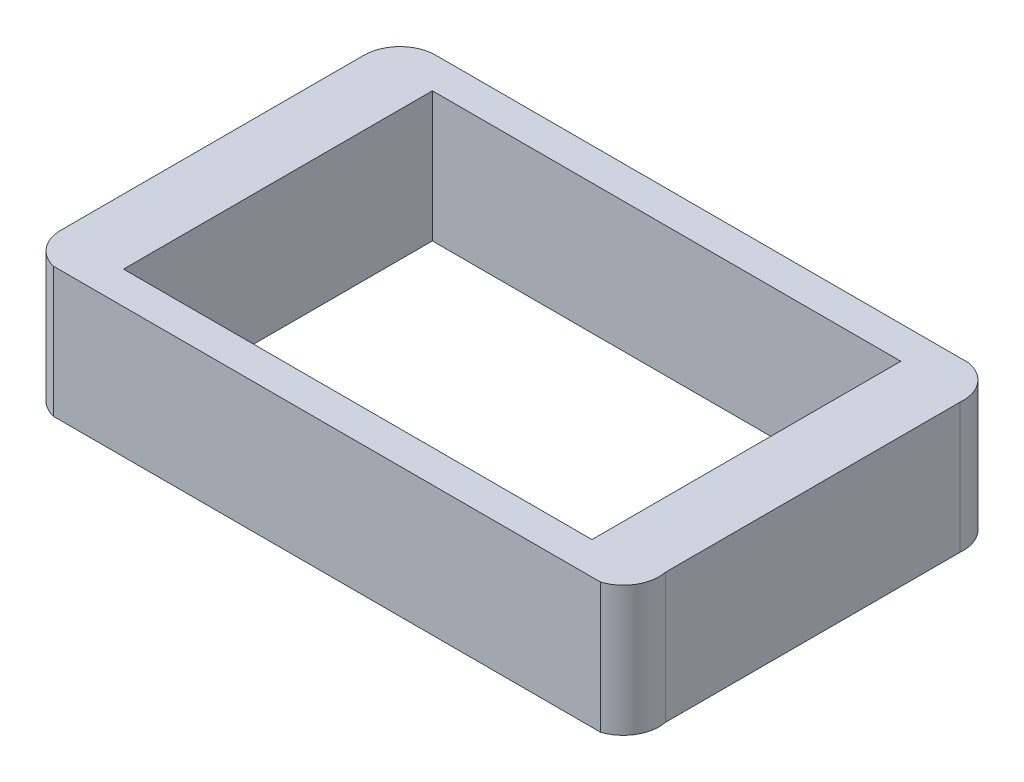
ISO-10303-21;
HEADER;
FILE_DESCRIPTION(('STEP AP214'),'2;1');
FILE_NAME('part.step','',(''),(''),'','','');
FILE_SCHEMA(('AUTOMOTIVE_DESIGN { 1 0 10303 214 1 1 1 1 }'));
ENDSEC;
DATA;
#1=APPLICATION_CONTEXT('core data for automotive mechanical design processes');
#2=APPLICATION_PROTOCOL_DEFINITION('international standard','automotive_design',2000,#1);
#3=PRODUCT_CONTEXT('',#1,'mechanical');
#4=PRODUCT('Part','Part','',(#3));
#5=PRODUCT_RELATED_PRODUCT_CATEGORY('part','',(#4));
#6=PRODUCT_DEFINITION_FORMATION('','',#4);
#7=PRODUCT_DEFINITION_CONTEXT('part definition',#1,'design');
#8=PRODUCT_DEFINITION('design','',#6,#7);
#9=PRODUCT_DEFINITION_SHAPE('','',#8);
#10=(LENGTH_UNIT() NAMED_UNIT(*) SI_UNIT(.MILLI.,.METRE.));
#11=(NAMED_UNIT(*) PLANE_ANGLE_UNIT() SI_UNIT($,.RADIAN.));
#12=(NAMED_UNIT(*) SI_UNIT($,.STERADIAN.) SOLID_ANGLE_UNIT());
#13=UNCERTAINTY_MEASURE_WITH_UNIT(LENGTH_MEASURE(1.E-05),#10,'distance_accuracy_value','');
#14=(GEOMETRIC_REPRESENTATION_CONTEXT(3) GLOBAL_UNCERTAINTY_ASSIGNED_CONTEXT((#13)) GLOBAL_UNIT_ASSIGNED_CONTEXT((#10,
#11,#12)) REPRESENTATION_CONTEXT('',''));
#15=CARTESIAN_POINT('',(0.,0.,0.));
#16=DIRECTION('',(0.,0.,1.));
#17=DIRECTION('',(1.,0.,0.));
#18=AXIS2_PLACEMENT_3D('',#15,#16,#17);
#19=CARTESIAN_POINT('',(-83.0138961913686,40.,-48.3517475262665));
#20=DIRECTION('',(0.,-1.,0.));
#21=DIRECTION('',(0.,0.,-1.));
#22=AXIS2_PLACEMENT_3D('',#19,#20,#21);
#23=PLANE('',#22);
#24=CARTESIAN_POINT('',(-83.0138961913686,40.,-48.3517475262665));
#25=DIRECTION('',(0.,1.,0.));
#26=DIRECTION('',(0.,0.,-1.));
#27=AXIS2_PLACEMENT_3D('',#24,#25,#26);
#28=CIRCLE('',#27,11.);
#29=CARTESIAN_POINT('',(-82.9854633410944,40.,-59.3517107795244));
#30=VERTEX_POINT('',#29);
#31=CARTESIAN_POINT('',(-94.0138594446266,40.,-48.3801803765406));
#32=VERTEX_POINT('',#31);
#33=EDGE_CURVE('E158',#30,#32,#28,.T.);
#34=ORIENTED_EDGE('',*,*,#33,.T.);
#35=DIRECTION('',(0.,0.,1.));
#36=VECTOR('',#35,1.);
#37=CARTESIAN_POINT('',(-94.0138594446266,40.,45.2987333063489));
#38=LINE('',#37,#36);
#39=CARTESIAN_POINT('',(-94.0138594446266,40.,45.2987333063489));
#40=VERTEX_POINT('',#39);
#41=EDGE_CURVE('E161',#32,#40,#38,.T.);
#42=ORIENTED_EDGE('',*,*,#41,.T.);
#43=CARTESIAN_POINT('',(-83.0195494276521,40.,44.9449717331755));
#44=DIRECTION('',(0.,1.,0.));
#45=DIRECTION('',(0.,0.,1.));
#46=AXIS2_PLACEMENT_3D('',#43,#44,#45);
#47=CIRCLE('',#46,11.);
#48=CARTESIAN_POINT('',(-85.5570668691795,40.,55.6482892204756));
#49=VERTEX_POINT('',#48);
#50=EDGE_CURVE('E164',#40,#49,#47,.T.);
#51=ORIENTED_EDGE('',*,*,#50,.T.);
#52=DIRECTION('',(1.,0.,0.));
#53=VECTOR('',#52,1.);
#54=CARTESIAN_POINT('',(82.7090211570023,40.,55.6482892204756));
#55=LINE('',#54,#53);
#56=CARTESIAN_POINT('',(82.7090211570023,40.,55.6482892204756));
#57=VERTEX_POINT('',#56);
#58=EDGE_CURVE('E166',#49,#57,#55,.T.);
#59=ORIENTED_EDGE('',*,*,#58,.T.);
#60=CARTESIAN_POINT('',(79.2707890930218,40.,45.1994347246844));
#61=DIRECTION('',(0.,1.,0.));
#62=DIRECTION('',(0.,0.,1.));
#63=AXIS2_PLACEMENT_3D('',#60,#61,#62);
#64=CIRCLE('',#63,11.);
#65=CARTESIAN_POINT('',(90.0633574660827,40.,43.0732955211498));
#66=VERTEX_POINT('',#65);
#67=EDGE_CURVE('E168',#57,#66,#64,.T.);
#68=ORIENTED_EDGE('',*,*,#67,.T.);
#69=DIRECTION('',(0.,0.,-1.));
#70=VECTOR('',#69,1.);
#71=CARTESIAN_POINT('',(90.0633574660827,40.,43.0732955211498));
#72=LINE('',#71,#70);
#73=CARTESIAN_POINT('',(90.0633574660827,40.,-47.5439350308669));
#74=VERTEX_POINT('',#73);
#75=EDGE_CURVE('E170',#66,#74,#72,.T.);
#76=ORIENTED_EDGE('',*,*,#75,.T.);
#77=CARTESIAN_POINT('',(79.1044180856765,40.,-48.4934863231006));
#78=DIRECTION('',(0.,1.,0.));
#79=DIRECTION('',(0.,0.,-1.));
#80=AXIS2_PLACEMENT_3D('',#77,#78,#79);
#81=CIRCLE('',#80,11.);
#82=CARTESIAN_POINT('',(80.8648048766744,40.,-59.3517107795244));
#83=VERTEX_POINT('',#82);
#84=EDGE_CURVE('E172',#74,#83,#81,.T.);
#85=ORIENTED_EDGE('',*,*,#84,.T.);
#86=DIRECTION('',(-1.,0.,0.));
#87=VECTOR('',#86,1.);
#88=CARTESIAN_POINT('',(80.8648048766744,40.,-59.3517107795244));
#89=LINE('',#88,#87);
#90=EDGE_CURVE('E174',#83,#30,#89,.T.);
#91=ORIENTED_EDGE('',*,*,#90,.T.);
#92=EDGE_LOOP('',(#34,#42,#51,#59,#68,#76,#85,#91));
#93=FACE_BOUND('',#92,.T.);
#94=DIRECTION('',(0.,0.,1.));
#95=VECTOR('',#94,1.);
#96=CARTESIAN_POINT('',(-74.0138594446266,40.,45.6482892204756));
#97=LINE('',#96,#95);
#98=CARTESIAN_POINT('',(-74.0138594446266,40.,-49.3517107795244));
#99=VERTEX_POINT('',#98);
#100=CARTESIAN_POINT('',(-74.0138594446266,40.,45.6482892204756));
#101=VERTEX_POINT('',#100);
#102=EDGE_CURVE('E122',#99,#101,#97,.T.);
#103=ORIENTED_EDGE('',*,*,#102,.F.);
#104=DIRECTION('',(-1.,0.,0.));
#105=VECTOR('',#104,1.);
#106=CARTESIAN_POINT('',(70.0633574660827,40.,-49.3517107795244));
#107=LINE('',#106,#105);
#108=CARTESIAN_POINT('',(70.0633574660827,40.,-49.3517107795244));
#109=VERTEX_POINT('',#108);
#110=EDGE_CURVE('E144',#109,#99,#107,.T.);
#111=ORIENTED_EDGE('',*,*,#110,.F.);
#112=DIRECTION('',(0.,0.,-1.));
#113=VECTOR('',#112,1.);
#114=CARTESIAN_POINT('',(70.0633574660827,40.,45.6482892204756));
#115=LINE('',#114,#113);
#116=CARTESIAN_POINT('',(70.0633574660827,40.,45.6482892204756));
#117=VERTEX_POINT('',#116);
#118=EDGE_CURVE('E142',#117,#109,#115,.T.);
#119=ORIENTED_EDGE('',*,*,#118,.F.);
#120=DIRECTION('',(1.,0.,0.));
#121=VECTOR('',#120,1.);
#122=CARTESIAN_POINT('',(70.0633574660827,40.,45.6482892204756));
#123=LINE('',#122,#121);
#124=EDGE_CURVE('E130',#101,#117,#123,.T.);
#125=ORIENTED_EDGE('',*,*,#124,.F.);
#126=EDGE_LOOP('',(#103,#111,#119,#125));
#127=FACE_BOUND('',#126,.T.);
#128=ADVANCED_FACE('F33',(#93,#127),#23,.F.);
#129=CARTESIAN_POINT('',(-83.0138961913686,0.,-48.3517475262665));
#130=DIRECTION('',(0.,-1.,0.));
#131=DIRECTION('',(0.,0.,-1.));
#132=AXIS2_PLACEMENT_3D('',#129,#130,#131);
#133=PLANE('',#132);
#134=CARTESIAN_POINT('',(-83.0138961913686,0.,-48.3517475262665));
#135=DIRECTION('',(0.,1.,0.));
#136=DIRECTION('',(0.,0.,-1.));
#137=AXIS2_PLACEMENT_3D('',#134,#135,#136);
#138=CIRCLE('',#137,11.);
#139=CARTESIAN_POINT('',(-82.9854633410944,0.,-59.3517107795244));
#140=VERTEX_POINT('',#139);
#141=CARTESIAN_POINT('',(-94.0138594446266,0.,-48.3801803765406));
#142=VERTEX_POINT('',#141);
#143=EDGE_CURVE('E138',#140,#142,#138,.T.);
#144=ORIENTED_EDGE('',*,*,#143,.F.);
#145=DIRECTION('',(-1.,0.,0.));
#146=VECTOR('',#145,1.);
#147=CARTESIAN_POINT('',(80.8648048766744,0.,-59.3517107795244));
#148=LINE('',#147,#146);
#149=CARTESIAN_POINT('',(80.8648048766744,0.,-59.3517107795244));
#150=VERTEX_POINT('',#149);
#151=EDGE_CURVE('E162',#150,#140,#148,.T.);
#152=ORIENTED_EDGE('',*,*,#151,.F.);
#153=CARTESIAN_POINT('',(79.1044180856765,0.,-48.4934863231006));
#154=DIRECTION('',(0.,1.,0.));
#155=DIRECTION('',(0.,0.,-1.));
#156=AXIS2_PLACEMENT_3D('',#153,#154,#155);
#157=CIRCLE('',#156,11.);
#158=CARTESIAN_POINT('',(90.0633574660827,0.,-47.5439350308669));
#159=VERTEX_POINT('',#158);
#160=EDGE_CURVE('E189',#159,#150,#157,.T.);
#161=ORIENTED_EDGE('',*,*,#160,.F.);
#162=DIRECTION('',(0.,0.,-1.));
#163=VECTOR('',#162,1.);
#164=CARTESIAN_POINT('',(90.0633574660827,0.,43.0732955211498));
#165=LINE('',#164,#163);
#166=CARTESIAN_POINT('',(90.0633574660827,0.,43.0732955211498));
#167=VERTEX_POINT('',#166);
#168=EDGE_CURVE('E187',#167,#159,#165,.T.);
#169=ORIENTED_EDGE('',*,*,#168,.F.);
#170=CARTESIAN_POINT('',(79.2707890930218,0.,45.1994347246844));
#171=DIRECTION('',(0.,1.,0.));
#172=DIRECTION('',(0.,0.,1.));
#173=AXIS2_PLACEMENT_3D('',#170,#171,#172);
#174=CIRCLE('',#173,11.);
#175=CARTESIAN_POINT('',(82.7090211570023,0.,55.6482892204756));
#176=VERTEX_POINT('',#175);
#177=EDGE_CURVE('E185',#176,#167,#174,.T.);
#178=ORIENTED_EDGE('',*,*,#177,.F.);
#179=DIRECTION('',(1.,0.,0.));
#180=VECTOR('',#179,1.);
#181=CARTESIAN_POINT('',(82.7090211570023,0.,55.6482892204756));
#182=LINE('',#181,#180);
#183=CARTESIAN_POINT('',(-85.5570668691795,0.,55.6482892204756));
#184=VERTEX_POINT('',#183);
#185=EDGE_CURVE('E183',#184,#176,#182,.T.);
#186=ORIENTED_EDGE('',*,*,#185,.F.);
#187=CARTESIAN_POINT('',(-83.0195494276521,0.,44.9449717331755));
#188=DIRECTION('',(0.,1.,0.));
#189=DIRECTION('',(0.,0.,1.));
#190=AXIS2_PLACEMENT_3D('',#187,#188,#189);
#191=CIRCLE('',#190,11.);
#192=CARTESIAN_POINT('',(-94.0138594446266,0.,45.2987333063489));
#193=VERTEX_POINT('',#192);
#194=EDGE_CURVE('E181',#193,#184,#191,.T.);
#195=ORIENTED_EDGE('',*,*,#194,.F.);
#196=DIRECTION('',(0.,0.,1.));
#197=VECTOR('',#196,1.);
#198=CARTESIAN_POINT('',(-94.0138594446266,0.,45.2987333063489));
#199=LINE('',#198,#197);
#200=EDGE_CURVE('E179',#142,#193,#199,.T.);
#201=ORIENTED_EDGE('',*,*,#200,.F.);
#202=EDGE_LOOP('',(#144,#152,#161,#169,#178,#186,#195,#201));
#203=FACE_BOUND('',#202,.T.);
#204=DIRECTION('',(-1.,0.,0.));
#205=VECTOR('',#204,1.);
#206=CARTESIAN_POINT('',(70.0633574660827,0.,-49.3517107795244));
#207=LINE('',#206,#205);
#208=CARTESIAN_POINT('',(70.0633574660827,0.,-49.3517107795244));
#209=VERTEX_POINT('',#208);
#210=CARTESIAN_POINT('',(-74.0138594446266,0.,-49.3517107795244));
#211=VERTEX_POINT('',#210);
#212=EDGE_CURVE('E131',#209,#211,#207,.T.);
#213=ORIENTED_EDGE('',*,*,#212,.T.);
#214=DIRECTION('',(0.,0.,1.));
#215=VECTOR('',#214,1.);
#216=CARTESIAN_POINT('',(-74.0138594446266,0.,45.6482892204756));
#217=LINE('',#216,#215);
#218=CARTESIAN_POINT('',(-74.0138594446266,0.,45.6482892204756));
#219=VERTEX_POINT('',#218);
#220=EDGE_CURVE('E56',#211,#219,#217,.T.);
#221=ORIENTED_EDGE('',*,*,#220,.T.);
#222=DIRECTION('',(1.,0.,0.));
#223=VECTOR('',#222,1.);
#224=CARTESIAN_POINT('',(70.0633574660827,0.,45.6482892204756));
#225=LINE('',#224,#223);
#226=CARTESIAN_POINT('',(70.0633574660827,0.,45.6482892204756));
#227=VERTEX_POINT('',#226);
#228=EDGE_CURVE('E137',#219,#227,#225,.T.);
#229=ORIENTED_EDGE('',*,*,#228,.T.);
#230=DIRECTION('',(0.,0.,-1.));
#231=VECTOR('',#230,1.);
#232=CARTESIAN_POINT('',(70.0633574660827,0.,45.6482892204756));
#233=LINE('',#232,#231);
#234=EDGE_CURVE('E150',#227,#209,#233,.T.);
#235=ORIENTED_EDGE('',*,*,#234,.T.);
#236=EDGE_LOOP('',(#213,#221,#229,#235));
#237=FACE_BOUND('',#236,.T.);
#238=ADVANCED_FACE('F219',(#203,#237),#133,.T.);
#239=CARTESIAN_POINT('',(-83.0138961913686,40.,-48.3517475262665));
#240=DIRECTION('',(0.,-1.,0.));
#241=DIRECTION('',(0.,0.,-1.));
#242=AXIS2_PLACEMENT_3D('',#239,#240,#241);
#243=CYLINDRICAL_SURFACE('',#242,11.);
#244=ORIENTED_EDGE('',*,*,#143,.T.);
#245=DIRECTION('',(0.,-1.,0.));
#246=VECTOR('',#245,1.);
#247=CARTESIAN_POINT('',(-94.0138594446266,40.,-48.3801803765406));
#248=LINE('',#247,#246);
#249=EDGE_CURVE('E11',#32,#142,#248,.T.);
#250=ORIENTED_EDGE('',*,*,#249,.F.);
#251=ORIENTED_EDGE('',*,*,#33,.F.);
#252=DIRECTION('',(0.,-1.,0.));
#253=VECTOR('',#252,1.);
#254=CARTESIAN_POINT('',(-82.9854633410944,40.,-59.3517107795244));
#255=LINE('',#254,#253);
#256=EDGE_CURVE('E176',#30,#140,#255,.T.);
#257=ORIENTED_EDGE('',*,*,#256,.T.);
#258=EDGE_LOOP('',(#244,#250,#251,#257));
#259=FACE_BOUND('',#258,.T.);
#260=ADVANCED_FACE('F35',(#259),#243,.T.);
#261=CARTESIAN_POINT('',(-94.0138594446266,40.,45.2987333063489));
#262=DIRECTION('',(1.,0.,0.));
#263=DIRECTION('',(0.,0.,-1.));
#264=AXIS2_PLACEMENT_3D('',#261,#262,#263);
#265=PLANE('',#264);
#266=ORIENTED_EDGE('',*,*,#200,.T.);
#267=DIRECTION('',(0.,-1.,0.));
#268=VECTOR('',#267,1.);
#269=CARTESIAN_POINT('',(-94.0138594446266,40.,45.2987333063489));
#270=LINE('',#269,#268);
#271=EDGE_CURVE('E41',#40,#193,#270,.T.);
#272=ORIENTED_EDGE('',*,*,#271,.F.);
#273=ORIENTED_EDGE('',*,*,#41,.F.);
#274=ORIENTED_EDGE('',*,*,#249,.T.);
#275=EDGE_LOOP('',(#266,#272,#273,#274));
#276=FACE_BOUND('',#275,.T.);
#277=ADVANCED_FACE('F236',(#276),#265,.F.);
#278=CARTESIAN_POINT('',(-83.0195494276521,40.,44.9449717331755));
#279=DIRECTION('',(0.,-1.,0.));
#280=DIRECTION('',(0.,0.,-1.));
#281=AXIS2_PLACEMENT_3D('',#278,#279,#280);
#282=CYLINDRICAL_SURFACE('',#281,11.);
#283=ORIENTED_EDGE('',*,*,#194,.T.);
#284=DIRECTION('',(0.,-1.,0.));
#285=VECTOR('',#284,1.);
#286=CARTESIAN_POINT('',(-85.5570668691795,40.,55.6482892204756));
#287=LINE('',#286,#285);
#288=EDGE_CURVE('E206',#49,#184,#287,.T.);
#289=ORIENTED_EDGE('',*,*,#288,.F.);
#290=ORIENTED_EDGE('',*,*,#50,.F.);
#291=ORIENTED_EDGE('',*,*,#271,.T.);
#292=EDGE_LOOP('',(#283,#289,#290,#291));
#293=FACE_BOUND('',#292,.T.);
#294=ADVANCED_FACE('F213',(#293),#282,.T.);
#295=CARTESIAN_POINT('',(82.7090211570023,40.,55.6482892204756));
#296=DIRECTION('',(0.,0.,-1.));
#297=DIRECTION('',(-1.,0.,0.));
#298=AXIS2_PLACEMENT_3D('',#295,#296,#297);
#299=PLANE('',#298);
#300=ORIENTED_EDGE('',*,*,#185,.T.);
#301=DIRECTION('',(0.,-1.,0.));
#302=VECTOR('',#301,1.);
#303=CARTESIAN_POINT('',(82.7090211570023,40.,55.6482892204756));
#304=LINE('',#303,#302);
#305=EDGE_CURVE('E203',#57,#176,#304,.T.);
#306=ORIENTED_EDGE('',*,*,#305,.F.);
#307=ORIENTED_EDGE('',*,*,#58,.F.);
#308=ORIENTED_EDGE('',*,*,#288,.T.);
#309=EDGE_LOOP('',(#300,#306,#307,#308));
#310=FACE_BOUND('',#309,.T.);
#311=ADVANCED_FACE('F225',(#310),#299,.F.);
#312=CARTESIAN_POINT('',(79.2707890930218,40.,45.1994347246844));
#313=DIRECTION('',(0.,-1.,0.));
#314=DIRECTION('',(0.,0.,-1.));
#315=AXIS2_PLACEMENT_3D('',#312,#313,#314);
#316=CYLINDRICAL_SURFACE('',#315,11.);
#317=ORIENTED_EDGE('',*,*,#177,.T.);
#318=DIRECTION('',(0.,-1.,0.));
#319=VECTOR('',#318,1.);
#320=CARTESIAN_POINT('',(90.0633574660827,40.,43.0732955211498));
#321=LINE('',#320,#319);
#322=EDGE_CURVE('E200',#66,#167,#321,.T.);
#323=ORIENTED_EDGE('',*,*,#322,.F.);
#324=ORIENTED_EDGE('',*,*,#67,.F.);
#325=ORIENTED_EDGE('',*,*,#305,.T.);
#326=EDGE_LOOP('',(#317,#323,#324,#325));
#327=FACE_BOUND('',#326,.T.);
#328=ADVANCED_FACE('F229',(#327),#316,.T.);
#329=CARTESIAN_POINT('',(90.0633574660827,40.,43.0732955211498));
#330=DIRECTION('',(-1.,0.,0.));
#331=DIRECTION('',(0.,0.,1.));
#332=AXIS2_PLACEMENT_3D('',#329,#330,#331);
#333=PLANE('',#332);
#334=ORIENTED_EDGE('',*,*,#168,.T.);
#335=DIRECTION('',(0.,-1.,0.));
#336=VECTOR('',#335,1.);
#337=CARTESIAN_POINT('',(90.0633574660827,40.,-47.5439350308669));
#338=LINE('',#337,#336);
#339=EDGE_CURVE('E197',#74,#159,#338,.T.);
#340=ORIENTED_EDGE('',*,*,#339,.F.);
#341=ORIENTED_EDGE('',*,*,#75,.F.);
#342=ORIENTED_EDGE('',*,*,#322,.T.);
#343=EDGE_LOOP('',(#334,#340,#341,#342));
#344=FACE_BOUND('',#343,.T.);
#345=ADVANCED_FACE('F249',(#344),#333,.F.);
#346=CARTESIAN_POINT('',(79.1044180856765,40.,-48.4934863231006));
#347=DIRECTION('',(0.,-1.,0.));
#348=DIRECTION('',(0.,0.,-1.));
#349=AXIS2_PLACEMENT_3D('',#346,#347,#348);
#350=CYLINDRICAL_SURFACE('',#349,11.);
#351=ORIENTED_EDGE('',*,*,#160,.T.);
#352=DIRECTION('',(0.,-1.,0.));
#353=VECTOR('',#352,1.);
#354=CARTESIAN_POINT('',(80.8648048766744,40.,-59.3517107795244));
#355=LINE('',#354,#353);
#356=EDGE_CURVE('E194',#83,#150,#355,.T.);
#357=ORIENTED_EDGE('',*,*,#356,.F.);
#358=ORIENTED_EDGE('',*,*,#84,.F.);
#359=ORIENTED_EDGE('',*,*,#339,.T.);
#360=EDGE_LOOP('',(#351,#357,#358,#359));
#361=FACE_BOUND('',#360,.T.);
#362=ADVANCED_FACE('F247',(#361),#350,.T.);
#363=CARTESIAN_POINT('',(80.8648048766744,40.,-59.3517107795244));
#364=DIRECTION('',(0.,0.,1.));
#365=DIRECTION('',(1.,0.,0.));
#366=AXIS2_PLACEMENT_3D('',#363,#364,#365);
#367=PLANE('',#366);
#368=ORIENTED_EDGE('',*,*,#151,.T.);
#369=ORIENTED_EDGE('',*,*,#256,.F.);
#370=ORIENTED_EDGE('',*,*,#90,.F.);
#371=ORIENTED_EDGE('',*,*,#356,.T.);
#372=EDGE_LOOP('',(#368,#369,#370,#371));
#373=FACE_BOUND('',#372,.T.);
#374=ADVANCED_FACE('F242',(#373),#367,.F.);
#375=CARTESIAN_POINT('',(-74.0138594446266,40.,45.6482892204756));
#376=DIRECTION('',(1.,0.,0.));
#377=DIRECTION('',(0.,0.,-1.));
#378=AXIS2_PLACEMENT_3D('',#375,#376,#377);
#379=PLANE('',#378);
#380=ORIENTED_EDGE('',*,*,#220,.F.);
#381=DIRECTION('',(0.,-1.,0.));
#382=VECTOR('',#381,1.);
#383=CARTESIAN_POINT('',(-74.0138594446266,40.,-49.3517107795244));
#384=LINE('',#383,#382);
#385=EDGE_CURVE('E126',#99,#211,#384,.T.);
#386=ORIENTED_EDGE('',*,*,#385,.F.);
#387=ORIENTED_EDGE('',*,*,#102,.T.);
#388=DIRECTION('',(0.,-1.,0.));
#389=VECTOR('',#388,1.);
#390=CARTESIAN_POINT('',(-74.0138594446266,40.,45.6482892204756));
#391=LINE('',#390,#389);
#392=EDGE_CURVE('E125',#101,#219,#391,.T.);
#393=ORIENTED_EDGE('',*,*,#392,.T.);
#394=EDGE_LOOP('',(#380,#386,#387,#393));
#395=FACE_BOUND('',#394,.T.);
#396=ADVANCED_FACE('F124',(#395),#379,.T.);
#397=CARTESIAN_POINT('',(70.0633574660827,40.,45.6482892204756));
#398=DIRECTION('',(0.,0.,-1.));
#399=DIRECTION('',(-1.,0.,0.));
#400=AXIS2_PLACEMENT_3D('',#397,#398,#399);
#401=PLANE('',#400);
#402=ORIENTED_EDGE('',*,*,#228,.F.);
#403=ORIENTED_EDGE('',*,*,#392,.F.);
#404=ORIENTED_EDGE('',*,*,#124,.T.);
#405=DIRECTION('',(0.,-1.,0.));
#406=VECTOR('',#405,1.);
#407=CARTESIAN_POINT('',(70.0633574660827,40.,45.6482892204756));
#408=LINE('',#407,#406);
#409=EDGE_CURVE('E139',#117,#227,#408,.T.);
#410=ORIENTED_EDGE('',*,*,#409,.T.);
#411=EDGE_LOOP('',(#402,#403,#404,#410));
#412=FACE_BOUND('',#411,.T.);
#413=ADVANCED_FACE('F134',(#412),#401,.T.);
#414=CARTESIAN_POINT('',(70.0633574660827,40.,45.6482892204756));
#415=DIRECTION('',(-1.,0.,0.));
#416=DIRECTION('',(0.,0.,1.));
#417=AXIS2_PLACEMENT_3D('',#414,#415,#416);
#418=PLANE('',#417);
#419=ORIENTED_EDGE('',*,*,#234,.F.);
#420=ORIENTED_EDGE('',*,*,#409,.F.);
#421=ORIENTED_EDGE('',*,*,#118,.T.);
#422=DIRECTION('',(0.,-1.,0.));
#423=VECTOR('',#422,1.);
#424=CARTESIAN_POINT('',(70.0633574660827,40.,-49.3517107795244));
#425=LINE('',#424,#423);
#426=EDGE_CURVE('E48',#109,#209,#425,.T.);
#427=ORIENTED_EDGE('',*,*,#426,.T.);
#428=EDGE_LOOP('',(#419,#420,#421,#427));
#429=FACE_BOUND('',#428,.T.);
#430=ADVANCED_FACE('F274',(#429),#418,.T.);
#431=CARTESIAN_POINT('',(70.0633574660827,40.,-49.3517107795244));
#432=DIRECTION('',(0.,0.,1.));
#433=DIRECTION('',(1.,0.,0.));
#434=AXIS2_PLACEMENT_3D('',#431,#432,#433);
#435=PLANE('',#434);
#436=ORIENTED_EDGE('',*,*,#212,.F.);
#437=ORIENTED_EDGE('',*,*,#426,.F.);
#438=ORIENTED_EDGE('',*,*,#110,.T.);
#439=ORIENTED_EDGE('',*,*,#385,.T.);
#440=EDGE_LOOP('',(#436,#437,#438,#439));
#441=FACE_BOUND('',#440,.T.);
#442=ADVANCED_FACE('F278',(#441),#435,.T.);
#443=CLOSED_SHELL('',(#128,#238,#260,#277,#294,#311,#328,#345,#362,#374,#396,#413,#430,#442));
#444=MANIFOLD_SOLID_BREP('B2',#443);
#445=ADVANCED_BREP_SHAPE_REPRESENTATION('',(#18,#444),#14);
#446=SHAPE_DEFINITION_REPRESENTATION(#9,#445);
ENDSEC;
END-ISO-10303-21;
